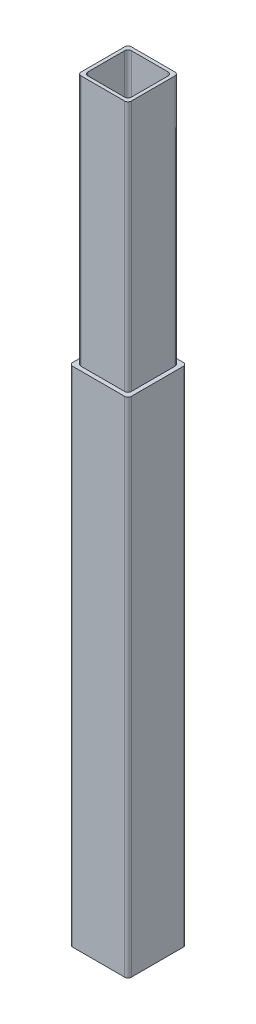
ISO-10303-21;
HEADER;
FILE_DESCRIPTION(('STEP AP214'),'2;1');
FILE_NAME('part.step','',(''),(''),'','','');
FILE_SCHEMA(('AUTOMOTIVE_DESIGN { 1 0 10303 214 1 1 1 1 }'));
ENDSEC;
DATA;
#1=APPLICATION_CONTEXT('core data for automotive mechanical design processes');
#2=APPLICATION_PROTOCOL_DEFINITION('international standard','automotive_design',2000,#1);
#3=PRODUCT_CONTEXT('',#1,'mechanical');
#4=PRODUCT('Part','Part','',(#3));
#5=PRODUCT_RELATED_PRODUCT_CATEGORY('part','',(#4));
#6=PRODUCT_DEFINITION_FORMATION('','',#4);
#7=PRODUCT_DEFINITION_CONTEXT('part definition',#1,'design');
#8=PRODUCT_DEFINITION('design','',#6,#7);
#9=PRODUCT_DEFINITION_SHAPE('','',#8);
#10=(LENGTH_UNIT() NAMED_UNIT(*) SI_UNIT(.MILLI.,.METRE.));
#11=(NAMED_UNIT(*) PLANE_ANGLE_UNIT() SI_UNIT($,.RADIAN.));
#12=(NAMED_UNIT(*) SI_UNIT($,.STERADIAN.) SOLID_ANGLE_UNIT());
#13=UNCERTAINTY_MEASURE_WITH_UNIT(LENGTH_MEASURE(1.E-05),#10,'distance_accuracy_value','');
#14=(GEOMETRIC_REPRESENTATION_CONTEXT(3) GLOBAL_UNCERTAINTY_ASSIGNED_CONTEXT((#13)) GLOBAL_UNIT_ASSIGNED_CONTEXT((#10,
#11,#12)) REPRESENTATION_CONTEXT('',''));
#15=CARTESIAN_POINT('',(0.,0.,0.));
#16=DIRECTION('',(0.,0.,1.));
#17=DIRECTION('',(1.,0.,0.));
#18=AXIS2_PLACEMENT_3D('',#15,#16,#17);
#19=CARTESIAN_POINT('',(-13.,450.,-13.));
#20=DIRECTION('',(0.,-1.,0.));
#21=DIRECTION('',(1.,0.,0.));
#22=AXIS2_PLACEMENT_3D('',#19,#20,#21);
#23=CYLINDRICAL_SURFACE('',#22,2.);
#24=CARTESIAN_POINT('',(-13.,200.,-13.));
#25=DIRECTION('',(0.,1.,0.));
#26=DIRECTION('',(-1.,0.,0.));
#27=AXIS2_PLACEMENT_3D('',#24,#25,#26);
#28=CIRCLE('',#27,2.);
#29=CARTESIAN_POINT('',(-13.,200.,-15.));
#30=VERTEX_POINT('',#29);
#31=CARTESIAN_POINT('',(-15.,200.,-13.));
#32=VERTEX_POINT('',#31);
#33=EDGE_CURVE('E286',#30,#32,#28,.T.);
#34=ORIENTED_EDGE('',*,*,#33,.T.);
#35=DIRECTION('',(0.,-1.,0.));
#36=VECTOR('',#35,1.);
#37=CARTESIAN_POINT('',(-15.,450.,-13.));
#38=LINE('',#37,#36);
#39=CARTESIAN_POINT('',(-15.,450.,-13.));
#40=VERTEX_POINT('',#39);
#41=EDGE_CURVE('E13',#40,#32,#38,.T.);
#42=ORIENTED_EDGE('',*,*,#41,.F.);
#43=CARTESIAN_POINT('',(-13.,450.,-13.));
#44=DIRECTION('',(0.,1.,0.));
#45=DIRECTION('',(-1.,0.,0.));
#46=AXIS2_PLACEMENT_3D('',#43,#44,#45);
#47=CIRCLE('',#46,2.);
#48=CARTESIAN_POINT('',(-13.,450.,-15.));
#49=VERTEX_POINT('',#48);
#50=EDGE_CURVE('E395',#49,#40,#47,.T.);
#51=ORIENTED_EDGE('',*,*,#50,.F.);
#52=DIRECTION('',(0.,-1.,0.));
#53=VECTOR('',#52,1.);
#54=CARTESIAN_POINT('',(-13.,450.,-15.));
#55=LINE('',#54,#53);
#56=EDGE_CURVE('E309',#49,#30,#55,.T.);
#57=ORIENTED_EDGE('',*,*,#56,.T.);
#58=EDGE_LOOP('',(#34,#42,#51,#57));
#59=FACE_BOUND('',#58,.T.);
#60=ADVANCED_FACE('F100',(#59),#23,.T.);
#61=CARTESIAN_POINT('',(-15.,450.,-13.));
#62=DIRECTION('',(1.,0.,0.));
#63=DIRECTION('',(0.,1.,0.));
#64=AXIS2_PLACEMENT_3D('',#61,#62,#63);
#65=PLANE('',#64);
#66=DIRECTION('',(0.,0.,1.));
#67=VECTOR('',#66,1.);
#68=CARTESIAN_POINT('',(-15.,200.,-13.));
#69=LINE('',#68,#67);
#70=CARTESIAN_POINT('',(-15.,200.,13.));
#71=VERTEX_POINT('',#70);
#72=EDGE_CURVE('E290',#32,#71,#69,.T.);
#73=ORIENTED_EDGE('',*,*,#72,.T.);
#74=DIRECTION('',(0.,-1.,0.));
#75=VECTOR('',#74,1.);
#76=CARTESIAN_POINT('',(-15.,450.,13.));
#77=LINE('',#76,#75);
#78=CARTESIAN_POINT('',(-15.,450.,13.));
#79=VERTEX_POINT('',#78);
#80=EDGE_CURVE('E111',#79,#71,#77,.T.);
#81=ORIENTED_EDGE('',*,*,#80,.F.);
#82=DIRECTION('',(0.,0.,1.));
#83=VECTOR('',#82,1.);
#84=CARTESIAN_POINT('',(-15.,450.,-13.));
#85=LINE('',#84,#83);
#86=EDGE_CURVE('E398',#40,#79,#85,.T.);
#87=ORIENTED_EDGE('',*,*,#86,.F.);
#88=ORIENTED_EDGE('',*,*,#41,.T.);
#89=EDGE_LOOP('',(#73,#81,#87,#88));
#90=FACE_BOUND('',#89,.T.);
#91=ADVANCED_FACE('F447',(#90),#65,.F.);
#92=CARTESIAN_POINT('',(-13.,450.,13.));
#93=DIRECTION('',(0.,-1.,0.));
#94=DIRECTION('',(1.,0.,0.));
#95=AXIS2_PLACEMENT_3D('',#92,#93,#94);
#96=CYLINDRICAL_SURFACE('',#95,2.);
#97=CARTESIAN_POINT('',(-13.,200.,13.));
#98=DIRECTION('',(0.,1.,0.));
#99=DIRECTION('',(1.,0.,0.));
#100=AXIS2_PLACEMENT_3D('',#97,#98,#99);
#101=CIRCLE('',#100,2.);
#102=CARTESIAN_POINT('',(-13.,200.,15.));
#103=VERTEX_POINT('',#102);
#104=EDGE_CURVE('E293',#71,#103,#101,.T.);
#105=ORIENTED_EDGE('',*,*,#104,.T.);
#106=DIRECTION('',(0.,-1.,0.));
#107=VECTOR('',#106,1.);
#108=CARTESIAN_POINT('',(-13.,450.,15.));
#109=LINE('',#108,#107);
#110=CARTESIAN_POINT('',(-13.,450.,15.));
#111=VERTEX_POINT('',#110);
#112=EDGE_CURVE('E320',#111,#103,#109,.T.);
#113=ORIENTED_EDGE('',*,*,#112,.F.);
#114=CARTESIAN_POINT('',(-13.,450.,13.));
#115=DIRECTION('',(0.,1.,0.));
#116=DIRECTION('',(1.,0.,0.));
#117=AXIS2_PLACEMENT_3D('',#114,#115,#116);
#118=CIRCLE('',#117,2.);
#119=EDGE_CURVE('E401',#79,#111,#118,.T.);
#120=ORIENTED_EDGE('',*,*,#119,.F.);
#121=ORIENTED_EDGE('',*,*,#80,.T.);
#122=EDGE_LOOP('',(#105,#113,#120,#121));
#123=FACE_BOUND('',#122,.T.);
#124=ADVANCED_FACE('F452',(#123),#96,.T.);
#125=CARTESIAN_POINT('',(13.,450.,15.));
#126=DIRECTION('',(0.,0.,-1.));
#127=DIRECTION('',(-1.,0.,0.));
#128=AXIS2_PLACEMENT_3D('',#125,#126,#127);
#129=PLANE('',#128);
#130=DIRECTION('',(1.,0.,0.));
#131=VECTOR('',#130,1.);
#132=CARTESIAN_POINT('',(13.,200.,15.));
#133=LINE('',#132,#131);
#134=CARTESIAN_POINT('',(13.,200.,15.));
#135=VERTEX_POINT('',#134);
#136=EDGE_CURVE('E296',#103,#135,#133,.T.);
#137=ORIENTED_EDGE('',*,*,#136,.T.);
#138=DIRECTION('',(0.,-1.,0.));
#139=VECTOR('',#138,1.);
#140=CARTESIAN_POINT('',(13.,450.,15.));
#141=LINE('',#140,#139);
#142=CARTESIAN_POINT('',(13.,450.,15.));
#143=VERTEX_POINT('',#142);
#144=EDGE_CURVE('E316',#143,#135,#141,.T.);
#145=ORIENTED_EDGE('',*,*,#144,.F.);
#146=DIRECTION('',(1.,0.,0.));
#147=VECTOR('',#146,1.);
#148=CARTESIAN_POINT('',(13.,450.,15.));
#149=LINE('',#148,#147);
#150=EDGE_CURVE('E404',#111,#143,#149,.T.);
#151=ORIENTED_EDGE('',*,*,#150,.F.);
#152=ORIENTED_EDGE('',*,*,#112,.T.);
#153=EDGE_LOOP('',(#137,#145,#151,#152));
#154=FACE_BOUND('',#153,.T.);
#155=ADVANCED_FACE('F422',(#154),#129,.F.);
#156=CARTESIAN_POINT('',(13.,450.,13.));
#157=DIRECTION('',(0.,-1.,0.));
#158=DIRECTION('',(1.,0.,0.));
#159=AXIS2_PLACEMENT_3D('',#156,#157,#158);
#160=CYLINDRICAL_SURFACE('',#159,2.);
#161=CARTESIAN_POINT('',(13.,200.,13.));
#162=DIRECTION('',(0.,1.,0.));
#163=DIRECTION('',(1.,0.,0.));
#164=AXIS2_PLACEMENT_3D('',#161,#162,#163);
#165=CIRCLE('',#164,2.);
#166=CARTESIAN_POINT('',(15.,200.,13.));
#167=VERTEX_POINT('',#166);
#168=EDGE_CURVE('E299',#135,#167,#165,.T.);
#169=ORIENTED_EDGE('',*,*,#168,.T.);
#170=DIRECTION('',(0.,-1.,0.));
#171=VECTOR('',#170,1.);
#172=CARTESIAN_POINT('',(15.,450.,13.));
#173=LINE('',#172,#171);
#174=CARTESIAN_POINT('',(15.,450.,13.));
#175=VERTEX_POINT('',#174);
#176=EDGE_CURVE('E242',#175,#167,#173,.T.);
#177=ORIENTED_EDGE('',*,*,#176,.F.);
#178=CARTESIAN_POINT('',(13.,450.,13.));
#179=DIRECTION('',(0.,1.,0.));
#180=DIRECTION('',(1.,0.,0.));
#181=AXIS2_PLACEMENT_3D('',#178,#179,#180);
#182=CIRCLE('',#181,2.);
#183=EDGE_CURVE('E231',#143,#175,#182,.T.);
#184=ORIENTED_EDGE('',*,*,#183,.F.);
#185=ORIENTED_EDGE('',*,*,#144,.T.);
#186=EDGE_LOOP('',(#169,#177,#184,#185));
#187=FACE_BOUND('',#186,.T.);
#188=ADVANCED_FACE('F426',(#187),#160,.T.);
#189=CARTESIAN_POINT('',(15.,450.,-13.));
#190=DIRECTION('',(-1.,0.,0.));
#191=DIRECTION('',(0.,-1.,0.));
#192=AXIS2_PLACEMENT_3D('',#189,#190,#191);
#193=PLANE('',#192);
#194=DIRECTION('',(0.,0.,-1.));
#195=VECTOR('',#194,1.);
#196=CARTESIAN_POINT('',(15.,200.,-13.));
#197=LINE('',#196,#195);
#198=CARTESIAN_POINT('',(15.,200.,-13.));
#199=VERTEX_POINT('',#198);
#200=EDGE_CURVE('E240',#167,#199,#197,.T.);
#201=ORIENTED_EDGE('',*,*,#200,.T.);
#202=DIRECTION('',(0.,-1.,0.));
#203=VECTOR('',#202,1.);
#204=CARTESIAN_POINT('',(15.,450.,-13.));
#205=LINE('',#204,#203);
#206=CARTESIAN_POINT('',(15.,450.,-13.));
#207=VERTEX_POINT('',#206);
#208=EDGE_CURVE('E237',#207,#199,#205,.T.);
#209=ORIENTED_EDGE('',*,*,#208,.F.);
#210=DIRECTION('',(0.,0.,-1.));
#211=VECTOR('',#210,1.);
#212=CARTESIAN_POINT('',(15.,450.,-13.));
#213=LINE('',#212,#211);
#214=EDGE_CURVE('E225',#175,#207,#213,.T.);
#215=ORIENTED_EDGE('',*,*,#214,.F.);
#216=ORIENTED_EDGE('',*,*,#176,.T.);
#217=EDGE_LOOP('',(#201,#209,#215,#216));
#218=FACE_BOUND('',#217,.T.);
#219=ADVANCED_FACE('F238',(#218),#193,.F.);
#220=CARTESIAN_POINT('',(13.,450.,-13.));
#221=DIRECTION('',(0.,-1.,0.));
#222=DIRECTION('',(1.,0.,0.));
#223=AXIS2_PLACEMENT_3D('',#220,#221,#222);
#224=CYLINDRICAL_SURFACE('',#223,2.);
#225=CARTESIAN_POINT('',(13.,200.,-13.));
#226=DIRECTION('',(0.,1.,0.));
#227=DIRECTION('',(1.,0.,0.));
#228=AXIS2_PLACEMENT_3D('',#225,#226,#227);
#229=CIRCLE('',#228,2.);
#230=CARTESIAN_POINT('',(13.,200.,-15.));
#231=VERTEX_POINT('',#230);
#232=EDGE_CURVE('E173',#199,#231,#229,.T.);
#233=ORIENTED_EDGE('',*,*,#232,.T.);
#234=DIRECTION('',(0.,-1.,0.));
#235=VECTOR('',#234,1.);
#236=CARTESIAN_POINT('',(13.,450.,-15.));
#237=LINE('',#236,#235);
#238=CARTESIAN_POINT('',(13.,450.,-15.));
#239=VERTEX_POINT('',#238);
#240=EDGE_CURVE('E243',#239,#231,#237,.T.);
#241=ORIENTED_EDGE('',*,*,#240,.F.);
#242=CARTESIAN_POINT('',(13.,450.,-13.));
#243=DIRECTION('',(0.,1.,0.));
#244=DIRECTION('',(1.,0.,0.));
#245=AXIS2_PLACEMENT_3D('',#242,#243,#244);
#246=CIRCLE('',#245,2.);
#247=EDGE_CURVE('E229',#207,#239,#246,.T.);
#248=ORIENTED_EDGE('',*,*,#247,.F.);
#249=ORIENTED_EDGE('',*,*,#208,.T.);
#250=EDGE_LOOP('',(#233,#241,#248,#249));
#251=FACE_BOUND('',#250,.T.);
#252=ADVANCED_FACE('F245',(#251),#224,.T.);
#253=CARTESIAN_POINT('',(-11.,450.,-11.));
#254=DIRECTION('',(0.,-1.,0.));
#255=DIRECTION('',(1.,0.,0.));
#256=AXIS2_PLACEMENT_3D('',#253,#254,#255);
#257=CYLINDRICAL_SURFACE('',#256,2.);
#258=CARTESIAN_POINT('',(-11.,200.,-11.));
#259=DIRECTION('',(0.,1.,0.));
#260=DIRECTION('',(-1.,0.,0.));
#261=AXIS2_PLACEMENT_3D('',#258,#259,#260);
#262=CIRCLE('',#261,2.);
#263=CARTESIAN_POINT('',(-11.,200.,-13.));
#264=VERTEX_POINT('',#263);
#265=CARTESIAN_POINT('',(-13.,200.,-11.));
#266=VERTEX_POINT('',#265);
#267=EDGE_CURVE('E254',#264,#266,#262,.T.);
#268=ORIENTED_EDGE('',*,*,#267,.F.);
#269=DIRECTION('',(0.,-1.,0.));
#270=VECTOR('',#269,1.);
#271=CARTESIAN_POINT('',(-11.,450.,-13.));
#272=LINE('',#271,#270);
#273=CARTESIAN_POINT('',(-11.,450.,-13.));
#274=VERTEX_POINT('',#273);
#275=EDGE_CURVE('E104',#274,#264,#272,.T.);
#276=ORIENTED_EDGE('',*,*,#275,.F.);
#277=CARTESIAN_POINT('',(-11.,450.,-11.));
#278=DIRECTION('',(0.,1.,0.));
#279=DIRECTION('',(-1.,0.,0.));
#280=AXIS2_PLACEMENT_3D('',#277,#278,#279);
#281=CIRCLE('',#280,2.);
#282=CARTESIAN_POINT('',(-13.,450.,-11.));
#283=VERTEX_POINT('',#282);
#284=EDGE_CURVE('E308',#274,#283,#281,.T.);
#285=ORIENTED_EDGE('',*,*,#284,.T.);
#286=DIRECTION('',(0.,-1.,0.));
#287=VECTOR('',#286,1.);
#288=CARTESIAN_POINT('',(-13.,450.,-11.));
#289=LINE('',#288,#287);
#290=EDGE_CURVE('E250',#283,#266,#289,.T.);
#291=ORIENTED_EDGE('',*,*,#290,.T.);
#292=EDGE_LOOP('',(#268,#276,#285,#291));
#293=FACE_BOUND('',#292,.T.);
#294=ADVANCED_FACE('F102',(#293),#257,.F.);
#295=CARTESIAN_POINT('',(11.,450.,-13.));
#296=DIRECTION('',(0.,0.,1.));
#297=DIRECTION('',(1.,0.,0.));
#298=AXIS2_PLACEMENT_3D('',#295,#296,#297);
#299=PLANE('',#298);
#300=DIRECTION('',(-1.,0.,0.));
#301=VECTOR('',#300,1.);
#302=CARTESIAN_POINT('',(11.,200.,-13.));
#303=LINE('',#302,#301);
#304=CARTESIAN_POINT('',(11.,200.,-13.));
#305=VERTEX_POINT('',#304);
#306=EDGE_CURVE('E258',#305,#264,#303,.T.);
#307=ORIENTED_EDGE('',*,*,#306,.F.);
#308=DIRECTION('',(0.,-1.,0.));
#309=VECTOR('',#308,1.);
#310=CARTESIAN_POINT('',(11.,450.,-13.));
#311=LINE('',#310,#309);
#312=CARTESIAN_POINT('',(11.,450.,-13.));
#313=VERTEX_POINT('',#312);
#314=EDGE_CURVE('E343',#313,#305,#311,.T.);
#315=ORIENTED_EDGE('',*,*,#314,.F.);
#316=DIRECTION('',(-1.,0.,0.));
#317=VECTOR('',#316,1.);
#318=CARTESIAN_POINT('',(11.,450.,-13.));
#319=LINE('',#318,#317);
#320=EDGE_CURVE('E356',#313,#274,#319,.T.);
#321=ORIENTED_EDGE('',*,*,#320,.T.);
#322=ORIENTED_EDGE('',*,*,#275,.T.);
#323=EDGE_LOOP('',(#307,#315,#321,#322));
#324=FACE_BOUND('',#323,.T.);
#325=ADVANCED_FACE('F354',(#324),#299,.T.);
#326=CARTESIAN_POINT('',(11.,450.,-11.));
#327=DIRECTION('',(0.,-1.,0.));
#328=DIRECTION('',(1.,0.,0.));
#329=AXIS2_PLACEMENT_3D('',#326,#327,#328);
#330=CYLINDRICAL_SURFACE('',#329,2.);
#331=CARTESIAN_POINT('',(11.,200.,-11.));
#332=DIRECTION('',(0.,1.,0.));
#333=DIRECTION('',(1.,0.,0.));
#334=AXIS2_PLACEMENT_3D('',#331,#332,#333);
#335=CIRCLE('',#334,2.);
#336=CARTESIAN_POINT('',(13.,200.,-11.));
#337=VERTEX_POINT('',#336);
#338=EDGE_CURVE('E262',#337,#305,#335,.T.);
#339=ORIENTED_EDGE('',*,*,#338,.F.);
#340=DIRECTION('',(0.,-1.,0.));
#341=VECTOR('',#340,1.);
#342=CARTESIAN_POINT('',(13.,450.,-11.));
#343=LINE('',#342,#341);
#344=CARTESIAN_POINT('',(13.,450.,-11.));
#345=VERTEX_POINT('',#344);
#346=EDGE_CURVE('E341',#345,#337,#343,.T.);
#347=ORIENTED_EDGE('',*,*,#346,.F.);
#348=CARTESIAN_POINT('',(11.,450.,-11.));
#349=DIRECTION('',(0.,1.,0.));
#350=DIRECTION('',(1.,0.,0.));
#351=AXIS2_PLACEMENT_3D('',#348,#349,#350);
#352=CIRCLE('',#351,2.);
#353=EDGE_CURVE('E364',#345,#313,#352,.T.);
#354=ORIENTED_EDGE('',*,*,#353,.T.);
#355=ORIENTED_EDGE('',*,*,#314,.T.);
#356=EDGE_LOOP('',(#339,#347,#354,#355));
#357=FACE_BOUND('',#356,.T.);
#358=ADVANCED_FACE('F362',(#357),#330,.F.);
#359=CARTESIAN_POINT('',(13.,450.,-11.));
#360=DIRECTION('',(-1.,0.,0.));
#361=DIRECTION('',(0.,-1.,0.));
#362=AXIS2_PLACEMENT_3D('',#359,#360,#361);
#363=PLANE('',#362);
#364=DIRECTION('',(0.,0.,-1.));
#365=VECTOR('',#364,1.);
#366=CARTESIAN_POINT('',(13.,200.,-11.));
#367=LINE('',#366,#365);
#368=CARTESIAN_POINT('',(13.,200.,11.));
#369=VERTEX_POINT('',#368);
#370=EDGE_CURVE('E266',#369,#337,#367,.T.);
#371=ORIENTED_EDGE('',*,*,#370,.F.);
#372=DIRECTION('',(0.,-1.,0.));
#373=VECTOR('',#372,1.);
#374=CARTESIAN_POINT('',(13.,450.,11.));
#375=LINE('',#374,#373);
#376=CARTESIAN_POINT('',(13.,450.,11.));
#377=VERTEX_POINT('',#376);
#378=EDGE_CURVE('E338',#377,#369,#375,.T.);
#379=ORIENTED_EDGE('',*,*,#378,.F.);
#380=DIRECTION('',(0.,0.,-1.));
#381=VECTOR('',#380,1.);
#382=CARTESIAN_POINT('',(13.,450.,-11.));
#383=LINE('',#382,#381);
#384=EDGE_CURVE('E370',#377,#345,#383,.T.);
#385=ORIENTED_EDGE('',*,*,#384,.T.);
#386=ORIENTED_EDGE('',*,*,#346,.T.);
#387=EDGE_LOOP('',(#371,#379,#385,#386));
#388=FACE_BOUND('',#387,.T.);
#389=ADVANCED_FACE('F374',(#388),#363,.T.);
#390=CARTESIAN_POINT('',(11.,450.,11.));
#391=DIRECTION('',(0.,-1.,0.));
#392=DIRECTION('',(1.,0.,0.));
#393=AXIS2_PLACEMENT_3D('',#390,#391,#392);
#394=CYLINDRICAL_SURFACE('',#393,2.);
#395=CARTESIAN_POINT('',(11.,200.,11.));
#396=DIRECTION('',(0.,1.,0.));
#397=DIRECTION('',(1.,0.,0.));
#398=AXIS2_PLACEMENT_3D('',#395,#396,#397);
#399=CIRCLE('',#398,2.);
#400=CARTESIAN_POINT('',(11.,200.,13.));
#401=VERTEX_POINT('',#400);
#402=EDGE_CURVE('E270',#401,#369,#399,.T.);
#403=ORIENTED_EDGE('',*,*,#402,.F.);
#404=DIRECTION('',(0.,-1.,0.));
#405=VECTOR('',#404,1.);
#406=CARTESIAN_POINT('',(11.,450.,13.));
#407=LINE('',#406,#405);
#408=CARTESIAN_POINT('',(11.,450.,13.));
#409=VERTEX_POINT('',#408);
#410=EDGE_CURVE('E335',#409,#401,#407,.T.);
#411=ORIENTED_EDGE('',*,*,#410,.F.);
#412=CARTESIAN_POINT('',(11.,450.,11.));
#413=DIRECTION('',(0.,1.,0.));
#414=DIRECTION('',(1.,0.,0.));
#415=AXIS2_PLACEMENT_3D('',#412,#413,#414);
#416=CIRCLE('',#415,2.);
#417=EDGE_CURVE('E376',#409,#377,#416,.T.);
#418=ORIENTED_EDGE('',*,*,#417,.T.);
#419=ORIENTED_EDGE('',*,*,#378,.T.);
#420=EDGE_LOOP('',(#403,#411,#418,#419));
#421=FACE_BOUND('',#420,.T.);
#422=ADVANCED_FACE('F463',(#421),#394,.F.);
#423=CARTESIAN_POINT('',(11.,450.,13.));
#424=DIRECTION('',(0.,0.,-1.));
#425=DIRECTION('',(-1.,0.,0.));
#426=AXIS2_PLACEMENT_3D('',#423,#424,#425);
#427=PLANE('',#426);
#428=DIRECTION('',(1.,0.,0.));
#429=VECTOR('',#428,1.);
#430=CARTESIAN_POINT('',(11.,200.,13.));
#431=LINE('',#430,#429);
#432=CARTESIAN_POINT('',(-11.,200.,13.));
#433=VERTEX_POINT('',#432);
#434=EDGE_CURVE('E274',#433,#401,#431,.T.);
#435=ORIENTED_EDGE('',*,*,#434,.F.);
#436=DIRECTION('',(0.,-1.,0.));
#437=VECTOR('',#436,1.);
#438=CARTESIAN_POINT('',(-11.,450.,13.));
#439=LINE('',#438,#437);
#440=CARTESIAN_POINT('',(-11.,450.,13.));
#441=VERTEX_POINT('',#440);
#442=EDGE_CURVE('E332',#441,#433,#439,.T.);
#443=ORIENTED_EDGE('',*,*,#442,.F.);
#444=DIRECTION('',(1.,0.,0.));
#445=VECTOR('',#444,1.);
#446=CARTESIAN_POINT('',(11.,450.,13.));
#447=LINE('',#446,#445);
#448=EDGE_CURVE('E380',#441,#409,#447,.T.);
#449=ORIENTED_EDGE('',*,*,#448,.T.);
#450=ORIENTED_EDGE('',*,*,#410,.T.);
#451=EDGE_LOOP('',(#435,#443,#449,#450));
#452=FACE_BOUND('',#451,.T.);
#453=ADVANCED_FACE('F459',(#452),#427,.T.);
#454=CARTESIAN_POINT('',(-11.,450.,11.));
#455=DIRECTION('',(0.,-1.,0.));
#456=DIRECTION('',(1.,0.,0.));
#457=AXIS2_PLACEMENT_3D('',#454,#455,#456);
#458=CYLINDRICAL_SURFACE('',#457,2.);
#459=CARTESIAN_POINT('',(-11.,200.,11.));
#460=DIRECTION('',(0.,1.,0.));
#461=DIRECTION('',(1.,0.,0.));
#462=AXIS2_PLACEMENT_3D('',#459,#460,#461);
#463=CIRCLE('',#462,2.);
#464=CARTESIAN_POINT('',(-13.,200.,11.));
#465=VERTEX_POINT('',#464);
#466=EDGE_CURVE('E278',#465,#433,#463,.T.);
#467=ORIENTED_EDGE('',*,*,#466,.F.);
#468=DIRECTION('',(0.,-1.,0.));
#469=VECTOR('',#468,1.);
#470=CARTESIAN_POINT('',(-13.,450.,11.));
#471=LINE('',#470,#469);
#472=CARTESIAN_POINT('',(-13.,450.,11.));
#473=VERTEX_POINT('',#472);
#474=EDGE_CURVE('E329',#473,#465,#471,.T.);
#475=ORIENTED_EDGE('',*,*,#474,.F.);
#476=CARTESIAN_POINT('',(-11.,450.,11.));
#477=DIRECTION('',(0.,1.,0.));
#478=DIRECTION('',(1.,0.,0.));
#479=AXIS2_PLACEMENT_3D('',#476,#477,#478);
#480=CIRCLE('',#479,2.);
#481=EDGE_CURVE('E387',#473,#441,#480,.T.);
#482=ORIENTED_EDGE('',*,*,#481,.T.);
#483=ORIENTED_EDGE('',*,*,#442,.T.);
#484=EDGE_LOOP('',(#467,#475,#482,#483));
#485=FACE_BOUND('',#484,.T.);
#486=ADVANCED_FACE('F441',(#485),#458,.F.);
#487=CARTESIAN_POINT('',(-13.,450.,-11.));
#488=DIRECTION('',(1.,0.,0.));
#489=DIRECTION('',(0.,1.,0.));
#490=AXIS2_PLACEMENT_3D('',#487,#488,#489);
#491=PLANE('',#490);
#492=DIRECTION('',(0.,0.,1.));
#493=VECTOR('',#492,1.);
#494=CARTESIAN_POINT('',(-13.,200.,-11.));
#495=LINE('',#494,#493);
#496=EDGE_CURVE('E282',#266,#465,#495,.T.);
#497=ORIENTED_EDGE('',*,*,#496,.F.);
#498=ORIENTED_EDGE('',*,*,#290,.F.);
#499=DIRECTION('',(0.,0.,1.));
#500=VECTOR('',#499,1.);
#501=CARTESIAN_POINT('',(-13.,450.,-11.));
#502=LINE('',#501,#500);
#503=EDGE_CURVE('E391',#283,#473,#502,.T.);
#504=ORIENTED_EDGE('',*,*,#503,.T.);
#505=ORIENTED_EDGE('',*,*,#474,.T.);
#506=EDGE_LOOP('',(#497,#498,#504,#505));
#507=FACE_BOUND('',#506,.T.);
#508=ADVANCED_FACE('F434',(#507),#491,.T.);
#509=CARTESIAN_POINT('',(13.,450.,-15.));
#510=DIRECTION('',(0.,0.,1.));
#511=DIRECTION('',(1.,0.,0.));
#512=AXIS2_PLACEMENT_3D('',#509,#510,#511);
#513=PLANE('',#512);
#514=DIRECTION('',(-1.,0.,0.));
#515=VECTOR('',#514,1.);
#516=CARTESIAN_POINT('',(13.,200.,-15.));
#517=LINE('',#516,#515);
#518=EDGE_CURVE('E179',#231,#30,#517,.T.);
#519=ORIENTED_EDGE('',*,*,#518,.T.);
#520=ORIENTED_EDGE('',*,*,#56,.F.);
#521=DIRECTION('',(-1.,0.,0.));
#522=VECTOR('',#521,1.);
#523=CARTESIAN_POINT('',(13.,450.,-15.));
#524=LINE('',#523,#522);
#525=EDGE_CURVE('E120',#239,#49,#524,.T.);
#526=ORIENTED_EDGE('',*,*,#525,.F.);
#527=ORIENTED_EDGE('',*,*,#240,.T.);
#528=EDGE_LOOP('',(#519,#520,#526,#527));
#529=FACE_BOUND('',#528,.T.);
#530=ADVANCED_FACE('F432',(#529),#513,.F.);
#531=CARTESIAN_POINT('',(-13.,450.,-13.));
#532=DIRECTION('',(0.,1.,0.));
#533=DIRECTION('',(-1.,0.,0.));
#534=AXIS2_PLACEMENT_3D('',#531,#532,#533);
#535=PLANE('',#534);
#536=ORIENTED_EDGE('',*,*,#284,.F.);
#537=ORIENTED_EDGE('',*,*,#320,.F.);
#538=ORIENTED_EDGE('',*,*,#353,.F.);
#539=ORIENTED_EDGE('',*,*,#384,.F.);
#540=ORIENTED_EDGE('',*,*,#417,.F.);
#541=ORIENTED_EDGE('',*,*,#448,.F.);
#542=ORIENTED_EDGE('',*,*,#481,.F.);
#543=ORIENTED_EDGE('',*,*,#503,.F.);
#544=EDGE_LOOP('',(#536,#537,#538,#539,#540,#541,#542,#543));
#545=FACE_BOUND('',#544,.T.);
#546=ORIENTED_EDGE('',*,*,#50,.T.);
#547=ORIENTED_EDGE('',*,*,#86,.T.);
#548=ORIENTED_EDGE('',*,*,#119,.T.);
#549=ORIENTED_EDGE('',*,*,#150,.T.);
#550=ORIENTED_EDGE('',*,*,#183,.T.);
#551=ORIENTED_EDGE('',*,*,#214,.T.);
#552=ORIENTED_EDGE('',*,*,#247,.T.);
#553=ORIENTED_EDGE('',*,*,#525,.T.);
#554=EDGE_LOOP('',(#546,#547,#548,#549,#550,#551,#552,#553));
#555=FACE_BOUND('',#554,.T.);
#556=ADVANCED_FACE('F227',(#545,#555),#535,.T.);
#557=CARTESIAN_POINT('',(-13.,200.,-13.));
#558=DIRECTION('',(0.,1.,0.));
#559=DIRECTION('',(-1.,0.,0.));
#560=AXIS2_PLACEMENT_3D('',#557,#558,#559);
#561=PLANE('',#560);
#562=ORIENTED_EDGE('',*,*,#267,.T.);
#563=ORIENTED_EDGE('',*,*,#496,.T.);
#564=ORIENTED_EDGE('',*,*,#466,.T.);
#565=ORIENTED_EDGE('',*,*,#434,.T.);
#566=ORIENTED_EDGE('',*,*,#402,.T.);
#567=ORIENTED_EDGE('',*,*,#370,.T.);
#568=ORIENTED_EDGE('',*,*,#338,.T.);
#569=ORIENTED_EDGE('',*,*,#306,.T.);
#570=EDGE_LOOP('',(#562,#563,#564,#565,#566,#567,#568,#569));
#571=FACE_BOUND('',#570,.T.);
#572=ORIENTED_EDGE('',*,*,#33,.F.);
#573=ORIENTED_EDGE('',*,*,#518,.F.);
#574=ORIENTED_EDGE('',*,*,#232,.F.);
#575=ORIENTED_EDGE('',*,*,#200,.F.);
#576=ORIENTED_EDGE('',*,*,#168,.F.);
#577=ORIENTED_EDGE('',*,*,#136,.F.);
#578=ORIENTED_EDGE('',*,*,#104,.F.);
#579=ORIENTED_EDGE('',*,*,#72,.F.);
#580=EDGE_LOOP('',(#572,#573,#574,#575,#576,#577,#578,#579));
#581=FACE_BOUND('',#580,.T.);
#582=ADVANCED_FACE('F359',(#571,#581),#561,.F.);
#583=CLOSED_SHELL('',(#60,#91,#124,#155,#188,#219,#252,#294,#325,#358,#389,#422,#453,#486,#508,
#530,#556,#582));
#584=MANIFOLD_SOLID_BREP('B2',#583);
#585=CARTESIAN_POINT('',(-15.5,300.,-15.5));
#586=DIRECTION('',(0.,-1.,0.));
#587=DIRECTION('',(0.,0.,-1.));
#588=AXIS2_PLACEMENT_3D('',#585,#586,#587);
#589=CYLINDRICAL_SURFACE('',#588,2.);
#590=CARTESIAN_POINT('',(-15.5,0.,-15.5));
#591=DIRECTION('',(0.,1.,0.));
#592=DIRECTION('',(0.,0.,1.));
#593=AXIS2_PLACEMENT_3D('',#590,#591,#592);
#594=CIRCLE('',#593,2.);
#595=CARTESIAN_POINT('',(-15.5,0.,-17.5));
#596=VERTEX_POINT('',#595);
#597=CARTESIAN_POINT('',(-17.5,0.,-15.5));
#598=VERTEX_POINT('',#597);
#599=EDGE_CURVE('E891',#596,#598,#594,.T.);
#600=ORIENTED_EDGE('',*,*,#599,.T.);
#601=DIRECTION('',(0.,-1.,0.));
#602=VECTOR('',#601,1.);
#603=CARTESIAN_POINT('',(-17.5,300.,-15.5));
#604=LINE('',#603,#602);
#605=CARTESIAN_POINT('',(-17.5,300.,-15.5));
#606=VERTEX_POINT('',#605);
#607=EDGE_CURVE('E98',#606,#598,#604,.T.);
#608=ORIENTED_EDGE('',*,*,#607,.F.);
#609=CARTESIAN_POINT('',(-15.5,300.,-15.5));
#610=DIRECTION('',(0.,1.,0.));
#611=DIRECTION('',(0.,0.,1.));
#612=AXIS2_PLACEMENT_3D('',#609,#610,#611);
#613=CIRCLE('',#612,2.);
#614=CARTESIAN_POINT('',(-15.5,300.,-17.5));
#615=VERTEX_POINT('',#614);
#616=EDGE_CURVE('E1000',#615,#606,#613,.T.);
#617=ORIENTED_EDGE('',*,*,#616,.F.);
#618=DIRECTION('',(0.,-1.,0.));
#619=VECTOR('',#618,1.);
#620=CARTESIAN_POINT('',(-15.5,300.,-17.5));
#621=LINE('',#620,#619);
#622=EDGE_CURVE('E914',#615,#596,#621,.T.);
#623=ORIENTED_EDGE('',*,*,#622,.T.);
#624=EDGE_LOOP('',(#600,#608,#617,#623));
#625=FACE_BOUND('',#624,.T.);
#626=ADVANCED_FACE('F705',(#625),#589,.T.);
#627=CARTESIAN_POINT('',(-17.5,300.,-15.5));
#628=DIRECTION('',(1.,0.,0.));
#629=DIRECTION('',(0.,0.,-1.));
#630=AXIS2_PLACEMENT_3D('',#627,#628,#629);
#631=PLANE('',#630);
#632=DIRECTION('',(0.,0.,1.));
#633=VECTOR('',#632,1.);
#634=CARTESIAN_POINT('',(-17.5,0.,-15.5));
#635=LINE('',#634,#633);
#636=CARTESIAN_POINT('',(-17.5,0.,15.5));
#637=VERTEX_POINT('',#636);
#638=EDGE_CURVE('E895',#598,#637,#635,.T.);
#639=ORIENTED_EDGE('',*,*,#638,.T.);
#640=DIRECTION('',(0.,-1.,0.));
#641=VECTOR('',#640,1.);
#642=CARTESIAN_POINT('',(-17.5,300.,15.5));
#643=LINE('',#642,#641);
#644=CARTESIAN_POINT('',(-17.5,300.,15.5));
#645=VERTEX_POINT('',#644);
#646=EDGE_CURVE('E716',#645,#637,#643,.T.);
#647=ORIENTED_EDGE('',*,*,#646,.F.);
#648=DIRECTION('',(0.,0.,1.));
#649=VECTOR('',#648,1.);
#650=CARTESIAN_POINT('',(-17.5,300.,-15.5));
#651=LINE('',#650,#649);
#652=EDGE_CURVE('E1003',#606,#645,#651,.T.);
#653=ORIENTED_EDGE('',*,*,#652,.F.);
#654=ORIENTED_EDGE('',*,*,#607,.T.);
#655=EDGE_LOOP('',(#639,#647,#653,#654));
#656=FACE_BOUND('',#655,.T.);
#657=ADVANCED_FACE('F1052',(#656),#631,.F.);
#658=CARTESIAN_POINT('',(-15.5,300.,15.5));
#659=DIRECTION('',(0.,-1.,0.));
#660=DIRECTION('',(0.,0.,-1.));
#661=AXIS2_PLACEMENT_3D('',#658,#659,#660);
#662=CYLINDRICAL_SURFACE('',#661,2.);
#663=CARTESIAN_POINT('',(-15.5,0.,15.5));
#664=DIRECTION('',(0.,1.,0.));
#665=DIRECTION('',(0.,0.,-1.));
#666=AXIS2_PLACEMENT_3D('',#663,#664,#665);
#667=CIRCLE('',#666,2.);
#668=CARTESIAN_POINT('',(-15.5,0.,17.5));
#669=VERTEX_POINT('',#668);
#670=EDGE_CURVE('E898',#637,#669,#667,.T.);
#671=ORIENTED_EDGE('',*,*,#670,.T.);
#672=DIRECTION('',(0.,-1.,0.));
#673=VECTOR('',#672,1.);
#674=CARTESIAN_POINT('',(-15.5,300.,17.5));
#675=LINE('',#674,#673);
#676=CARTESIAN_POINT('',(-15.5,300.,17.5));
#677=VERTEX_POINT('',#676);
#678=EDGE_CURVE('E925',#677,#669,#675,.T.);
#679=ORIENTED_EDGE('',*,*,#678,.F.);
#680=CARTESIAN_POINT('',(-15.5,300.,15.5));
#681=DIRECTION('',(0.,1.,0.));
#682=DIRECTION('',(0.,0.,-1.));
#683=AXIS2_PLACEMENT_3D('',#680,#681,#682);
#684=CIRCLE('',#683,2.);
#685=EDGE_CURVE('E1006',#645,#677,#684,.T.);
#686=ORIENTED_EDGE('',*,*,#685,.F.);
#687=ORIENTED_EDGE('',*,*,#646,.T.);
#688=EDGE_LOOP('',(#671,#679,#686,#687));
#689=FACE_BOUND('',#688,.T.);
#690=ADVANCED_FACE('F1057',(#689),#662,.T.);
#691=CARTESIAN_POINT('',(15.5,300.,17.5));
#692=DIRECTION('',(0.,0.,-1.));
#693=DIRECTION('',(-1.,0.,0.));
#694=AXIS2_PLACEMENT_3D('',#691,#692,#693);
#695=PLANE('',#694);
#696=DIRECTION('',(1.,0.,0.));
#697=VECTOR('',#696,1.);
#698=CARTESIAN_POINT('',(15.5,0.,17.5));
#699=LINE('',#698,#697);
#700=CARTESIAN_POINT('',(15.5,0.,17.5));
#701=VERTEX_POINT('',#700);
#702=EDGE_CURVE('E901',#669,#701,#699,.T.);
#703=ORIENTED_EDGE('',*,*,#702,.T.);
#704=DIRECTION('',(0.,-1.,0.));
#705=VECTOR('',#704,1.);
#706=CARTESIAN_POINT('',(15.5,300.,17.5));
#707=LINE('',#706,#705);
#708=CARTESIAN_POINT('',(15.5,300.,17.5));
#709=VERTEX_POINT('',#708);
#710=EDGE_CURVE('E921',#709,#701,#707,.T.);
#711=ORIENTED_EDGE('',*,*,#710,.F.);
#712=DIRECTION('',(1.,0.,0.));
#713=VECTOR('',#712,1.);
#714=CARTESIAN_POINT('',(15.5,300.,17.5));
#715=LINE('',#714,#713);
#716=EDGE_CURVE('E1009',#677,#709,#715,.T.);
#717=ORIENTED_EDGE('',*,*,#716,.F.);
#718=ORIENTED_EDGE('',*,*,#678,.T.);
#719=EDGE_LOOP('',(#703,#711,#717,#718));
#720=FACE_BOUND('',#719,.T.);
#721=ADVANCED_FACE('F1027',(#720),#695,.F.);
#722=CARTESIAN_POINT('',(15.5,300.,15.5));
#723=DIRECTION('',(0.,-1.,0.));
#724=DIRECTION('',(0.,0.,-1.));
#725=AXIS2_PLACEMENT_3D('',#722,#723,#724);
#726=CYLINDRICAL_SURFACE('',#725,2.);
#727=CARTESIAN_POINT('',(15.5,0.,15.5));
#728=DIRECTION('',(0.,1.,0.));
#729=DIRECTION('',(0.,0.,-1.));
#730=AXIS2_PLACEMENT_3D('',#727,#728,#729);
#731=CIRCLE('',#730,2.);
#732=CARTESIAN_POINT('',(17.5,0.,15.5));
#733=VERTEX_POINT('',#732);
#734=EDGE_CURVE('E904',#701,#733,#731,.T.);
#735=ORIENTED_EDGE('',*,*,#734,.T.);
#736=DIRECTION('',(0.,-1.,0.));
#737=VECTOR('',#736,1.);
#738=CARTESIAN_POINT('',(17.5,300.,15.5));
#739=LINE('',#738,#737);
#740=CARTESIAN_POINT('',(17.5,300.,15.5));
#741=VERTEX_POINT('',#740);
#742=EDGE_CURVE('E847',#741,#733,#739,.T.);
#743=ORIENTED_EDGE('',*,*,#742,.F.);
#744=CARTESIAN_POINT('',(15.5,300.,15.5));
#745=DIRECTION('',(0.,1.,0.));
#746=DIRECTION('',(0.,0.,-1.));
#747=AXIS2_PLACEMENT_3D('',#744,#745,#746);
#748=CIRCLE('',#747,2.);
#749=EDGE_CURVE('E836',#709,#741,#748,.T.);
#750=ORIENTED_EDGE('',*,*,#749,.F.);
#751=ORIENTED_EDGE('',*,*,#710,.T.);
#752=EDGE_LOOP('',(#735,#743,#750,#751));
#753=FACE_BOUND('',#752,.T.);
#754=ADVANCED_FACE('F1031',(#753),#726,.T.);
#755=CARTESIAN_POINT('',(17.5,300.,-15.5));
#756=DIRECTION('',(-1.,0.,0.));
#757=DIRECTION('',(0.,0.,1.));
#758=AXIS2_PLACEMENT_3D('',#755,#756,#757);
#759=PLANE('',#758);
#760=DIRECTION('',(0.,0.,-1.));
#761=VECTOR('',#760,1.);
#762=CARTESIAN_POINT('',(17.5,0.,-15.5));
#763=LINE('',#762,#761);
#764=CARTESIAN_POINT('',(17.5,0.,-15.5));
#765=VERTEX_POINT('',#764);
#766=EDGE_CURVE('E845',#733,#765,#763,.T.);
#767=ORIENTED_EDGE('',*,*,#766,.T.);
#768=DIRECTION('',(0.,-1.,0.));
#769=VECTOR('',#768,1.);
#770=CARTESIAN_POINT('',(17.5,300.,-15.5));
#771=LINE('',#770,#769);
#772=CARTESIAN_POINT('',(17.5,300.,-15.5));
#773=VERTEX_POINT('',#772);
#774=EDGE_CURVE('E842',#773,#765,#771,.T.);
#775=ORIENTED_EDGE('',*,*,#774,.F.);
#776=DIRECTION('',(0.,0.,-1.));
#777=VECTOR('',#776,1.);
#778=CARTESIAN_POINT('',(17.5,300.,-15.5));
#779=LINE('',#778,#777);
#780=EDGE_CURVE('E830',#741,#773,#779,.T.);
#781=ORIENTED_EDGE('',*,*,#780,.F.);
#782=ORIENTED_EDGE('',*,*,#742,.T.);
#783=EDGE_LOOP('',(#767,#775,#781,#782));
#784=FACE_BOUND('',#783,.T.);
#785=ADVANCED_FACE('F843',(#784),#759,.F.);
#786=CARTESIAN_POINT('',(15.5,300.,-15.5));
#787=DIRECTION('',(0.,-1.,0.));
#788=DIRECTION('',(0.,0.,-1.));
#789=AXIS2_PLACEMENT_3D('',#786,#787,#788);
#790=CYLINDRICAL_SURFACE('',#789,2.);
#791=CARTESIAN_POINT('',(15.5,0.,-15.5));
#792=DIRECTION('',(0.,1.,0.));
#793=DIRECTION('',(0.,0.,-1.));
#794=AXIS2_PLACEMENT_3D('',#791,#792,#793);
#795=CIRCLE('',#794,2.);
#796=CARTESIAN_POINT('',(15.5,0.,-17.5));
#797=VERTEX_POINT('',#796);
#798=EDGE_CURVE('E778',#765,#797,#795,.T.);
#799=ORIENTED_EDGE('',*,*,#798,.T.);
#800=DIRECTION('',(0.,-1.,0.));
#801=VECTOR('',#800,1.);
#802=CARTESIAN_POINT('',(15.5,300.,-17.5));
#803=LINE('',#802,#801);
#804=CARTESIAN_POINT('',(15.5,300.,-17.5));
#805=VERTEX_POINT('',#804);
#806=EDGE_CURVE('E848',#805,#797,#803,.T.);
#807=ORIENTED_EDGE('',*,*,#806,.F.);
#808=CARTESIAN_POINT('',(15.5,300.,-15.5));
#809=DIRECTION('',(0.,1.,0.));
#810=DIRECTION('',(0.,0.,-1.));
#811=AXIS2_PLACEMENT_3D('',#808,#809,#810);
#812=CIRCLE('',#811,2.);
#813=EDGE_CURVE('E834',#773,#805,#812,.T.);
#814=ORIENTED_EDGE('',*,*,#813,.F.);
#815=ORIENTED_EDGE('',*,*,#774,.T.);
#816=EDGE_LOOP('',(#799,#807,#814,#815));
#817=FACE_BOUND('',#816,.T.);
#818=ADVANCED_FACE('F850',(#817),#790,.T.);
#819=CARTESIAN_POINT('',(-13.,300.,-13.));
#820=DIRECTION('',(0.,-1.,0.));
#821=DIRECTION('',(0.,0.,-1.));
#822=AXIS2_PLACEMENT_3D('',#819,#820,#821);
#823=CYLINDRICAL_SURFACE('',#822,2.);
#824=CARTESIAN_POINT('',(-13.,0.,-13.));
#825=DIRECTION('',(0.,1.,0.));
#826=DIRECTION('',(0.,0.,1.));
#827=AXIS2_PLACEMENT_3D('',#824,#825,#826);
#828=CIRCLE('',#827,2.);
#829=CARTESIAN_POINT('',(-13.,0.,-15.));
#830=VERTEX_POINT('',#829);
#831=CARTESIAN_POINT('',(-15.,0.,-13.));
#832=VERTEX_POINT('',#831);
#833=EDGE_CURVE('E859',#830,#832,#828,.T.);
#834=ORIENTED_EDGE('',*,*,#833,.F.);
#835=DIRECTION('',(0.,-1.,0.));
#836=VECTOR('',#835,1.);
#837=CARTESIAN_POINT('',(-13.,300.,-15.));
#838=LINE('',#837,#836);
#839=CARTESIAN_POINT('',(-13.,300.,-15.));
#840=VERTEX_POINT('',#839);
#841=EDGE_CURVE('E709',#840,#830,#838,.T.);
#842=ORIENTED_EDGE('',*,*,#841,.F.);
#843=CARTESIAN_POINT('',(-13.,300.,-13.));
#844=DIRECTION('',(0.,1.,0.));
#845=DIRECTION('',(0.,0.,1.));
#846=AXIS2_PLACEMENT_3D('',#843,#844,#845);
#847=CIRCLE('',#846,2.);
#848=CARTESIAN_POINT('',(-15.,300.,-13.));
#849=VERTEX_POINT('',#848);
#850=EDGE_CURVE('E913',#840,#849,#847,.T.);
#851=ORIENTED_EDGE('',*,*,#850,.T.);
#852=DIRECTION('',(0.,-1.,0.));
#853=VECTOR('',#852,1.);
#854=CARTESIAN_POINT('',(-15.,300.,-13.));
#855=LINE('',#854,#853);
#856=EDGE_CURVE('E855',#849,#832,#855,.T.);
#857=ORIENTED_EDGE('',*,*,#856,.T.);
#858=EDGE_LOOP('',(#834,#842,#851,#857));
#859=FACE_BOUND('',#858,.T.);
#860=ADVANCED_FACE('F707',(#859),#823,.F.);
#861=CARTESIAN_POINT('',(13.,300.,-15.));
#862=DIRECTION('',(0.,0.,1.));
#863=DIRECTION('',(1.,0.,0.));
#864=AXIS2_PLACEMENT_3D('',#861,#862,#863);
#865=PLANE('',#864);
#866=DIRECTION('',(-1.,0.,0.));
#867=VECTOR('',#866,1.);
#868=CARTESIAN_POINT('',(13.,0.,-15.));
#869=LINE('',#868,#867);
#870=CARTESIAN_POINT('',(13.,0.,-15.));
#871=VERTEX_POINT('',#870);
#872=EDGE_CURVE('E863',#871,#830,#869,.T.);
#873=ORIENTED_EDGE('',*,*,#872,.F.);
#874=DIRECTION('',(0.,-1.,0.));
#875=VECTOR('',#874,1.);
#876=CARTESIAN_POINT('',(13.,300.,-15.));
#877=LINE('',#876,#875);
#878=CARTESIAN_POINT('',(13.,300.,-15.));
#879=VERTEX_POINT('',#878);
#880=EDGE_CURVE('E948',#879,#871,#877,.T.);
#881=ORIENTED_EDGE('',*,*,#880,.F.);
#882=DIRECTION('',(-1.,0.,0.));
#883=VECTOR('',#882,1.);
#884=CARTESIAN_POINT('',(13.,300.,-15.));
#885=LINE('',#884,#883);
#886=EDGE_CURVE('E961',#879,#840,#885,.T.);
#887=ORIENTED_EDGE('',*,*,#886,.T.);
#888=ORIENTED_EDGE('',*,*,#841,.T.);
#889=EDGE_LOOP('',(#873,#881,#887,#888));
#890=FACE_BOUND('',#889,.T.);
#891=ADVANCED_FACE('F959',(#890),#865,.T.);
#892=CARTESIAN_POINT('',(13.,300.,-13.));
#893=DIRECTION('',(0.,-1.,0.));
#894=DIRECTION('',(0.,0.,-1.));
#895=AXIS2_PLACEMENT_3D('',#892,#893,#894);
#896=CYLINDRICAL_SURFACE('',#895,2.);
#897=CARTESIAN_POINT('',(13.,0.,-13.));
#898=DIRECTION('',(0.,1.,0.));
#899=DIRECTION('',(0.,0.,-1.));
#900=AXIS2_PLACEMENT_3D('',#897,#898,#899);
#901=CIRCLE('',#900,2.);
#902=CARTESIAN_POINT('',(15.,0.,-13.));
#903=VERTEX_POINT('',#902);
#904=EDGE_CURVE('E867',#903,#871,#901,.T.);
#905=ORIENTED_EDGE('',*,*,#904,.F.);
#906=DIRECTION('',(0.,-1.,0.));
#907=VECTOR('',#906,1.);
#908=CARTESIAN_POINT('',(15.,300.,-13.));
#909=LINE('',#908,#907);
#910=CARTESIAN_POINT('',(15.,300.,-13.));
#911=VERTEX_POINT('',#910);
#912=EDGE_CURVE('E946',#911,#903,#909,.T.);
#913=ORIENTED_EDGE('',*,*,#912,.F.);
#914=CARTESIAN_POINT('',(13.,300.,-13.));
#915=DIRECTION('',(0.,1.,0.));
#916=DIRECTION('',(0.,0.,-1.));
#917=AXIS2_PLACEMENT_3D('',#914,#915,#916);
#918=CIRCLE('',#917,2.);
#919=EDGE_CURVE('E969',#911,#879,#918,.T.);
#920=ORIENTED_EDGE('',*,*,#919,.T.);
#921=ORIENTED_EDGE('',*,*,#880,.T.);
#922=EDGE_LOOP('',(#905,#913,#920,#921));
#923=FACE_BOUND('',#922,.T.);
#924=ADVANCED_FACE('F967',(#923),#896,.F.);
#925=CARTESIAN_POINT('',(15.,300.,-13.));
#926=DIRECTION('',(-1.,0.,0.));
#927=DIRECTION('',(0.,0.,1.));
#928=AXIS2_PLACEMENT_3D('',#925,#926,#927);
#929=PLANE('',#928);
#930=DIRECTION('',(0.,0.,-1.));
#931=VECTOR('',#930,1.);
#932=CARTESIAN_POINT('',(15.,0.,-13.));
#933=LINE('',#932,#931);
#934=CARTESIAN_POINT('',(15.,0.,13.));
#935=VERTEX_POINT('',#934);
#936=EDGE_CURVE('E871',#935,#903,#933,.T.);
#937=ORIENTED_EDGE('',*,*,#936,.F.);
#938=DIRECTION('',(0.,-1.,0.));
#939=VECTOR('',#938,1.);
#940=CARTESIAN_POINT('',(15.,300.,13.));
#941=LINE('',#940,#939);
#942=CARTESIAN_POINT('',(15.,300.,13.));
#943=VERTEX_POINT('',#942);
#944=EDGE_CURVE('E943',#943,#935,#941,.T.);
#945=ORIENTED_EDGE('',*,*,#944,.F.);
#946=DIRECTION('',(0.,0.,-1.));
#947=VECTOR('',#946,1.);
#948=CARTESIAN_POINT('',(15.,300.,-13.));
#949=LINE('',#948,#947);
#950=EDGE_CURVE('E975',#943,#911,#949,.T.);
#951=ORIENTED_EDGE('',*,*,#950,.T.);
#952=ORIENTED_EDGE('',*,*,#912,.T.);
#953=EDGE_LOOP('',(#937,#945,#951,#952));
#954=FACE_BOUND('',#953,.T.);
#955=ADVANCED_FACE('F979',(#954),#929,.T.);
#956=CARTESIAN_POINT('',(13.,300.,13.));
#957=DIRECTION('',(0.,-1.,0.));
#958=DIRECTION('',(0.,0.,-1.));
#959=AXIS2_PLACEMENT_3D('',#956,#957,#958);
#960=CYLINDRICAL_SURFACE('',#959,2.);
#961=CARTESIAN_POINT('',(13.,0.,13.));
#962=DIRECTION('',(0.,1.,0.));
#963=DIRECTION('',(0.,0.,-1.));
#964=AXIS2_PLACEMENT_3D('',#961,#962,#963);
#965=CIRCLE('',#964,2.);
#966=CARTESIAN_POINT('',(13.,0.,15.));
#967=VERTEX_POINT('',#966);
#968=EDGE_CURVE('E875',#967,#935,#965,.T.);
#969=ORIENTED_EDGE('',*,*,#968,.F.);
#970=DIRECTION('',(0.,-1.,0.));
#971=VECTOR('',#970,1.);
#972=CARTESIAN_POINT('',(13.,300.,15.));
#973=LINE('',#972,#971);
#974=CARTESIAN_POINT('',(13.,300.,15.));
#975=VERTEX_POINT('',#974);
#976=EDGE_CURVE('E940',#975,#967,#973,.T.);
#977=ORIENTED_EDGE('',*,*,#976,.F.);
#978=CARTESIAN_POINT('',(13.,300.,13.));
#979=DIRECTION('',(0.,1.,0.));
#980=DIRECTION('',(0.,0.,-1.));
#981=AXIS2_PLACEMENT_3D('',#978,#979,#980);
#982=CIRCLE('',#981,2.);
#983=EDGE_CURVE('E981',#975,#943,#982,.T.);
#984=ORIENTED_EDGE('',*,*,#983,.T.);
#985=ORIENTED_EDGE('',*,*,#944,.T.);
#986=EDGE_LOOP('',(#969,#977,#984,#985));
#987=FACE_BOUND('',#986,.T.);
#988=ADVANCED_FACE('F1068',(#987),#960,.F.);
#989=CARTESIAN_POINT('',(13.,300.,15.));
#990=DIRECTION('',(0.,0.,-1.));
#991=DIRECTION('',(-1.,0.,0.));
#992=AXIS2_PLACEMENT_3D('',#989,#990,#991);
#993=PLANE('',#992);
#994=DIRECTION('',(1.,0.,0.));
#995=VECTOR('',#994,1.);
#996=CARTESIAN_POINT('',(13.,0.,15.));
#997=LINE('',#996,#995);
#998=CARTESIAN_POINT('',(-13.,0.,15.));
#999=VERTEX_POINT('',#998);
#1000=EDGE_CURVE('E879',#999,#967,#997,.T.);
#1001=ORIENTED_EDGE('',*,*,#1000,.F.);
#1002=DIRECTION('',(0.,-1.,0.));
#1003=VECTOR('',#1002,1.);
#1004=CARTESIAN_POINT('',(-13.,300.,15.));
#1005=LINE('',#1004,#1003);
#1006=CARTESIAN_POINT('',(-13.,300.,15.));
#1007=VERTEX_POINT('',#1006);
#1008=EDGE_CURVE('E937',#1007,#999,#1005,.T.);
#1009=ORIENTED_EDGE('',*,*,#1008,.F.);
#1010=DIRECTION('',(1.,0.,0.));
#1011=VECTOR('',#1010,1.);
#1012=CARTESIAN_POINT('',(13.,300.,15.));
#1013=LINE('',#1012,#1011);
#1014=EDGE_CURVE('E985',#1007,#975,#1013,.T.);
#1015=ORIENTED_EDGE('',*,*,#1014,.T.);
#1016=ORIENTED_EDGE('',*,*,#976,.T.);
#1017=EDGE_LOOP('',(#1001,#1009,#1015,#1016));
#1018=FACE_BOUND('',#1017,.T.);
#1019=ADVANCED_FACE('F1064',(#1018),#993,.T.);
#1020=CARTESIAN_POINT('',(-13.,300.,13.));
#1021=DIRECTION('',(0.,-1.,0.));
#1022=DIRECTION('',(0.,0.,-1.));
#1023=AXIS2_PLACEMENT_3D('',#1020,#1021,#1022);
#1024=CYLINDRICAL_SURFACE('',#1023,2.);
#1025=CARTESIAN_POINT('',(-13.,0.,13.));
#1026=DIRECTION('',(0.,1.,0.));
#1027=DIRECTION('',(0.,0.,-1.));
#1028=AXIS2_PLACEMENT_3D('',#1025,#1026,#1027);
#1029=CIRCLE('',#1028,2.);
#1030=CARTESIAN_POINT('',(-15.,0.,13.));
#1031=VERTEX_POINT('',#1030);
#1032=EDGE_CURVE('E883',#1031,#999,#1029,.T.);
#1033=ORIENTED_EDGE('',*,*,#1032,.F.);
#1034=DIRECTION('',(0.,-1.,0.));
#1035=VECTOR('',#1034,1.);
#1036=CARTESIAN_POINT('',(-15.,300.,13.));
#1037=LINE('',#1036,#1035);
#1038=CARTESIAN_POINT('',(-15.,300.,13.));
#1039=VERTEX_POINT('',#1038);
#1040=EDGE_CURVE('E934',#1039,#1031,#1037,.T.);
#1041=ORIENTED_EDGE('',*,*,#1040,.F.);
#1042=CARTESIAN_POINT('',(-13.,300.,13.));
#1043=DIRECTION('',(0.,1.,0.));
#1044=DIRECTION('',(0.,0.,-1.));
#1045=AXIS2_PLACEMENT_3D('',#1042,#1043,#1044);
#1046=CIRCLE('',#1045,2.);
#1047=EDGE_CURVE('E992',#1039,#1007,#1046,.T.);
#1048=ORIENTED_EDGE('',*,*,#1047,.T.);
#1049=ORIENTED_EDGE('',*,*,#1008,.T.);
#1050=EDGE_LOOP('',(#1033,#1041,#1048,#1049));
#1051=FACE_BOUND('',#1050,.T.);
#1052=ADVANCED_FACE('F1046',(#1051),#1024,.F.);
#1053=CARTESIAN_POINT('',(-15.,300.,-13.));
#1054=DIRECTION('',(1.,0.,0.));
#1055=DIRECTION('',(0.,0.,-1.));
#1056=AXIS2_PLACEMENT_3D('',#1053,#1054,#1055);
#1057=PLANE('',#1056);
#1058=DIRECTION('',(0.,0.,1.));
#1059=VECTOR('',#1058,1.);
#1060=CARTESIAN_POINT('',(-15.,0.,-13.));
#1061=LINE('',#1060,#1059);
#1062=EDGE_CURVE('E887',#832,#1031,#1061,.T.);
#1063=ORIENTED_EDGE('',*,*,#1062,.F.);
#1064=ORIENTED_EDGE('',*,*,#856,.F.);
#1065=DIRECTION('',(0.,0.,1.));
#1066=VECTOR('',#1065,1.);
#1067=CARTESIAN_POINT('',(-15.,300.,-13.));
#1068=LINE('',#1067,#1066);
#1069=EDGE_CURVE('E996',#849,#1039,#1068,.T.);
#1070=ORIENTED_EDGE('',*,*,#1069,.T.);
#1071=ORIENTED_EDGE('',*,*,#1040,.T.);
#1072=EDGE_LOOP('',(#1063,#1064,#1070,#1071));
#1073=FACE_BOUND('',#1072,.T.);
#1074=ADVANCED_FACE('F1039',(#1073),#1057,.T.);
#1075=CARTESIAN_POINT('',(15.5,300.,-17.5));
#1076=DIRECTION('',(0.,0.,1.));
#1077=DIRECTION('',(1.,0.,0.));
#1078=AXIS2_PLACEMENT_3D('',#1075,#1076,#1077);
#1079=PLANE('',#1078);
#1080=DIRECTION('',(-1.,0.,0.));
#1081=VECTOR('',#1080,1.);
#1082=CARTESIAN_POINT('',(15.5,0.,-17.5));
#1083=LINE('',#1082,#1081);
#1084=EDGE_CURVE('E784',#797,#596,#1083,.T.);
#1085=ORIENTED_EDGE('',*,*,#1084,.T.);
#1086=ORIENTED_EDGE('',*,*,#622,.F.);
#1087=DIRECTION('',(-1.,0.,0.));
#1088=VECTOR('',#1087,1.);
#1089=CARTESIAN_POINT('',(15.5,300.,-17.5));
#1090=LINE('',#1089,#1088);
#1091=EDGE_CURVE('E725',#805,#615,#1090,.T.);
#1092=ORIENTED_EDGE('',*,*,#1091,.F.);
#1093=ORIENTED_EDGE('',*,*,#806,.T.);
#1094=EDGE_LOOP('',(#1085,#1086,#1092,#1093));
#1095=FACE_BOUND('',#1094,.T.);
#1096=ADVANCED_FACE('F1037',(#1095),#1079,.F.);
#1097=CARTESIAN_POINT('',(-15.5,300.,-15.5));
#1098=DIRECTION('',(0.,1.,0.));
#1099=DIRECTION('',(0.,0.,1.));
#1100=AXIS2_PLACEMENT_3D('',#1097,#1098,#1099);
#1101=PLANE('',#1100);
#1102=ORIENTED_EDGE('',*,*,#850,.F.);
#1103=ORIENTED_EDGE('',*,*,#886,.F.);
#1104=ORIENTED_EDGE('',*,*,#919,.F.);
#1105=ORIENTED_EDGE('',*,*,#950,.F.);
#1106=ORIENTED_EDGE('',*,*,#983,.F.);
#1107=ORIENTED_EDGE('',*,*,#1014,.F.);
#1108=ORIENTED_EDGE('',*,*,#1047,.F.);
#1109=ORIENTED_EDGE('',*,*,#1069,.F.);
#1110=EDGE_LOOP('',(#1102,#1103,#1104,#1105,#1106,#1107,#1108,#1109));
#1111=FACE_BOUND('',#1110,.T.);
#1112=ORIENTED_EDGE('',*,*,#616,.T.);
#1113=ORIENTED_EDGE('',*,*,#652,.T.);
#1114=ORIENTED_EDGE('',*,*,#685,.T.);
#1115=ORIENTED_EDGE('',*,*,#716,.T.);
#1116=ORIENTED_EDGE('',*,*,#749,.T.);
#1117=ORIENTED_EDGE('',*,*,#780,.T.);
#1118=ORIENTED_EDGE('',*,*,#813,.T.);
#1119=ORIENTED_EDGE('',*,*,#1091,.T.);
#1120=EDGE_LOOP('',(#1112,#1113,#1114,#1115,#1116,#1117,#1118,#1119));
#1121=FACE_BOUND('',#1120,.T.);
#1122=ADVANCED_FACE('F832',(#1111,#1121),#1101,.T.);
#1123=CARTESIAN_POINT('',(-15.5,0.,-15.5));
#1124=DIRECTION('',(0.,1.,0.));
#1125=DIRECTION('',(0.,0.,1.));
#1126=AXIS2_PLACEMENT_3D('',#1123,#1124,#1125);
#1127=PLANE('',#1126);
#1128=ORIENTED_EDGE('',*,*,#833,.T.);
#1129=ORIENTED_EDGE('',*,*,#1062,.T.);
#1130=ORIENTED_EDGE('',*,*,#1032,.T.);
#1131=ORIENTED_EDGE('',*,*,#1000,.T.);
#1132=ORIENTED_EDGE('',*,*,#968,.T.);
#1133=ORIENTED_EDGE('',*,*,#936,.T.);
#1134=ORIENTED_EDGE('',*,*,#904,.T.);
#1135=ORIENTED_EDGE('',*,*,#872,.T.);
#1136=EDGE_LOOP('',(#1128,#1129,#1130,#1131,#1132,#1133,#1134,#1135));
#1137=FACE_BOUND('',#1136,.T.);
#1138=ORIENTED_EDGE('',*,*,#599,.F.);
#1139=ORIENTED_EDGE('',*,*,#1084,.F.);
#1140=ORIENTED_EDGE('',*,*,#798,.F.);
#1141=ORIENTED_EDGE('',*,*,#766,.F.);
#1142=ORIENTED_EDGE('',*,*,#734,.F.);
#1143=ORIENTED_EDGE('',*,*,#702,.F.);
#1144=ORIENTED_EDGE('',*,*,#670,.F.);
#1145=ORIENTED_EDGE('',*,*,#638,.F.);
#1146=EDGE_LOOP('',(#1138,#1139,#1140,#1141,#1142,#1143,#1144,#1145));
#1147=FACE_BOUND('',#1146,.T.);
#1148=ADVANCED_FACE('F964',(#1137,#1147),#1127,.F.);
#1149=CLOSED_SHELL('',(#626,#657,#690,#721,#754,#785,#818,#860,#891,#924,#955,#988,#1019,#1052,
#1074,#1096,#1122,#1148));
#1150=MANIFOLD_SOLID_BREP('B7',#1149);
#1151=ADVANCED_BREP_SHAPE_REPRESENTATION('',(#18,#584,#1150),#14);
#1152=SHAPE_DEFINITION_REPRESENTATION(#9,#1151);
ENDSEC;
END-ISO-10303-21;
